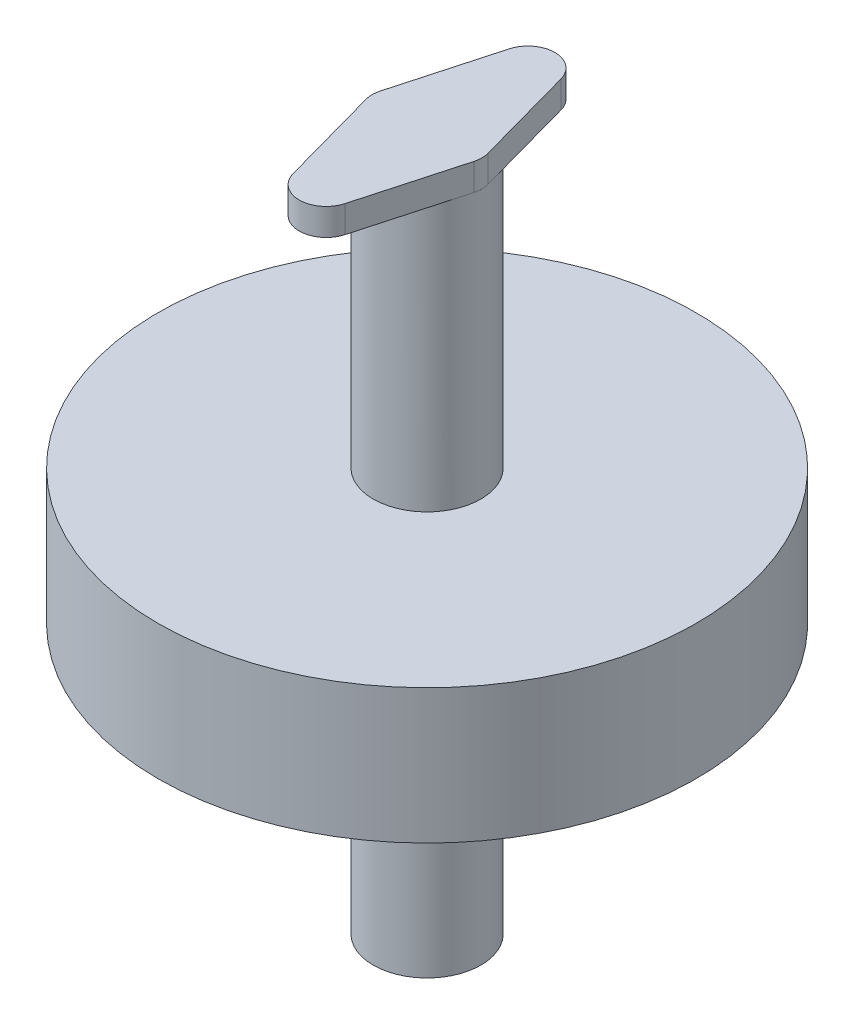
ISO-10303-21;
HEADER;
FILE_DESCRIPTION(('STEP AP214'),'2;1');
FILE_NAME('part.step','',(''),(''),'','','');
FILE_SCHEMA(('AUTOMOTIVE_DESIGN { 1 0 10303 214 1 1 1 1 }'));
ENDSEC;
DATA;
#1=APPLICATION_CONTEXT('core data for automotive mechanical design processes');
#2=APPLICATION_PROTOCOL_DEFINITION('international standard','automotive_design',2000,#1);
#3=PRODUCT_CONTEXT('',#1,'mechanical');
#4=PRODUCT('Part','Part','',(#3));
#5=PRODUCT_RELATED_PRODUCT_CATEGORY('part','',(#4));
#6=PRODUCT_DEFINITION_FORMATION('','',#4);
#7=PRODUCT_DEFINITION_CONTEXT('part definition',#1,'design');
#8=PRODUCT_DEFINITION('design','',#6,#7);
#9=PRODUCT_DEFINITION_SHAPE('','',#8);
#10=(LENGTH_UNIT() NAMED_UNIT(*) SI_UNIT(.MILLI.,.METRE.));
#11=(NAMED_UNIT(*) PLANE_ANGLE_UNIT() SI_UNIT($,.RADIAN.));
#12=(NAMED_UNIT(*) SI_UNIT($,.STERADIAN.) SOLID_ANGLE_UNIT());
#13=UNCERTAINTY_MEASURE_WITH_UNIT(LENGTH_MEASURE(1.E-05),#10,'distance_accuracy_value','');
#14=(GEOMETRIC_REPRESENTATION_CONTEXT(3) GLOBAL_UNCERTAINTY_ASSIGNED_CONTEXT((#13)) GLOBAL_UNIT_ASSIGNED_CONTEXT((#10,
#11,#12)) REPRESENTATION_CONTEXT('',''));
#15=CARTESIAN_POINT('',(0.,0.,0.));
#16=DIRECTION('',(0.,0.,1.));
#17=DIRECTION('',(1.,0.,0.));
#18=AXIS2_PLACEMENT_3D('',#15,#16,#17);
#19=CARTESIAN_POINT('',(0.,5.,0.));
#20=DIRECTION('',(0.,-1.,0.));
#21=DIRECTION('',(0.,0.,-1.));
#22=AXIS2_PLACEMENT_3D('',#19,#20,#21);
#23=CYLINDRICAL_SURFACE('',#22,10.);
#24=CARTESIAN_POINT('',(0.,5.,0.));
#25=DIRECTION('',(0.,1.,0.));
#26=DIRECTION('',(0.,0.,1.));
#27=AXIS2_PLACEMENT_3D('',#24,#25,#26);
#28=CIRCLE('',#27,10.);
#29=CARTESIAN_POINT('',(0.,5.,10.));
#30=VERTEX_POINT('',#29);
#31=EDGE_CURVE('E171',#30,#30,#28,.T.);
#32=ORIENTED_EDGE('',*,*,#31,.F.);
#33=EDGE_LOOP('',(#32));
#34=FACE_BOUND('',#33,.T.);
#35=CARTESIAN_POINT('',(0.,0.,0.));
#36=DIRECTION('',(0.,1.,0.));
#37=DIRECTION('',(0.,0.,1.));
#38=AXIS2_PLACEMENT_3D('',#35,#36,#37);
#39=CIRCLE('',#38,10.);
#40=CARTESIAN_POINT('',(0.,0.,10.));
#41=VERTEX_POINT('',#40);
#42=EDGE_CURVE('E174',#41,#41,#39,.T.);
#43=ORIENTED_EDGE('',*,*,#42,.T.);
#44=EDGE_LOOP('',(#43));
#45=FACE_BOUND('',#44,.T.);
#46=ADVANCED_FACE('F39',(#34,#45),#23,.T.);
#47=CARTESIAN_POINT('',(0.,5.,0.));
#48=DIRECTION('',(0.,1.,0.));
#49=DIRECTION('',(0.,0.,1.));
#50=AXIS2_PLACEMENT_3D('',#47,#48,#49);
#51=PLANE('',#50);
#52=CARTESIAN_POINT('',(0.,5.,0.));
#53=DIRECTION('',(0.,1.,0.));
#54=DIRECTION('',(0.,0.,1.));
#55=AXIS2_PLACEMENT_3D('',#52,#53,#54);
#56=CIRCLE('',#55,2.);
#57=CARTESIAN_POINT('',(0.,5.,2.));
#58=VERTEX_POINT('',#57);
#59=EDGE_CURVE('E167',#58,#58,#56,.T.);
#60=ORIENTED_EDGE('',*,*,#59,.F.);
#61=EDGE_LOOP('',(#60));
#62=FACE_BOUND('',#61,.T.);
#63=ORIENTED_EDGE('',*,*,#31,.T.);
#64=EDGE_LOOP('',(#63));
#65=FACE_BOUND('',#64,.T.);
#66=ADVANCED_FACE('F237',(#62,#65),#51,.T.);
#67=CARTESIAN_POINT('',(0.,0.,0.));
#68=DIRECTION('',(0.,1.,0.));
#69=DIRECTION('',(0.,0.,1.));
#70=AXIS2_PLACEMENT_3D('',#67,#68,#69);
#71=PLANE('',#70);
#72=CARTESIAN_POINT('',(0.,0.,0.));
#73=DIRECTION('',(0.,1.,0.));
#74=DIRECTION('',(0.,0.,1.));
#75=AXIS2_PLACEMENT_3D('',#72,#73,#74);
#76=CIRCLE('',#75,2.);
#77=CARTESIAN_POINT('',(0.,0.,2.));
#78=VERTEX_POINT('',#77);
#79=EDGE_CURVE('E166',#78,#78,#76,.T.);
#80=ORIENTED_EDGE('',*,*,#79,.T.);
#81=EDGE_LOOP('',(#80));
#82=FACE_BOUND('',#81,.T.);
#83=ORIENTED_EDGE('',*,*,#42,.F.);
#84=EDGE_LOOP('',(#83));
#85=FACE_BOUND('',#84,.T.);
#86=ADVANCED_FACE('F243',(#82,#85),#71,.F.);
#87=CARTESIAN_POINT('',(0.,-10.,0.));
#88=DIRECTION('',(0.,1.,0.));
#89=DIRECTION('',(0.,0.,1.));
#90=AXIS2_PLACEMENT_3D('',#87,#88,#89);
#91=PLANE('',#90);
#92=CARTESIAN_POINT('',(0.,-10.,0.));
#93=DIRECTION('',(0.,1.,0.));
#94=DIRECTION('',(0.,0.,1.));
#95=AXIS2_PLACEMENT_3D('',#92,#93,#94);
#96=CIRCLE('',#95,2.);
#97=CARTESIAN_POINT('',(0.,-10.,2.));
#98=VERTEX_POINT('',#97);
#99=EDGE_CURVE('E144',#98,#98,#96,.T.);
#100=ORIENTED_EDGE('',*,*,#99,.F.);
#101=EDGE_LOOP('',(#100));
#102=FACE_BOUND('',#101,.T.);
#103=ADVANCED_FACE('F360',(#102),#91,.F.);
#104=CARTESIAN_POINT('',(0.,-10.,0.));
#105=DIRECTION('',(0.,1.,0.));
#106=DIRECTION('',(0.,0.,1.));
#107=AXIS2_PLACEMENT_3D('',#104,#105,#106);
#108=CYLINDRICAL_SURFACE('',#107,2.);
#109=ORIENTED_EDGE('',*,*,#99,.T.);
#110=EDGE_LOOP('',(#109));
#111=FACE_BOUND('',#110,.T.);
#112=ORIENTED_EDGE('',*,*,#79,.F.);
#113=EDGE_LOOP('',(#112));
#114=FACE_BOUND('',#113,.T.);
#115=ADVANCED_FACE('F351',(#111,#114),#108,.T.);
#116=ORIENTED_EDGE('',*,*,#59,.T.);
#117=EDGE_LOOP('',(#116));
#118=FACE_BOUND('',#117,.T.);
#119=CARTESIAN_POINT('',(0.,15.,0.));
#120=DIRECTION('',(0.,1.,0.));
#121=DIRECTION('',(0.,0.,1.));
#122=AXIS2_PLACEMENT_3D('',#119,#120,#121);
#123=CIRCLE('',#122,2.);
#124=CARTESIAN_POINT('',(1.92757763930679,15.,0.533333333333333));
#125=VERTEX_POINT('',#124);
#126=CARTESIAN_POINT('',(1.92757763930679,15.,-0.533333333333333));
#127=VERTEX_POINT('',#126);
#128=EDGE_CURVE('E134',#125,#127,#123,.T.);
#129=ORIENTED_EDGE('',*,*,#128,.F.);
#130=CARTESIAN_POINT('',(-1.92757763930679,15.,0.533333333333333));
#131=VERTEX_POINT('',#130);
#132=EDGE_CURVE('E137',#131,#125,#123,.T.);
#133=ORIENTED_EDGE('',*,*,#132,.F.);
#134=CARTESIAN_POINT('',(-1.92757763930679,15.,-0.533333333333333));
#135=VERTEX_POINT('',#134);
#136=EDGE_CURVE('E150',#135,#131,#123,.T.);
#137=ORIENTED_EDGE('',*,*,#136,.F.);
#138=EDGE_CURVE('E140',#127,#135,#123,.T.);
#139=ORIENTED_EDGE('',*,*,#138,.F.);
#140=EDGE_LOOP('',(#129,#133,#137,#139));
#141=FACE_BOUND('',#140,.T.);
#142=ADVANCED_FACE('F135',(#118,#141),#108,.T.);
#143=CARTESIAN_POINT('',(0.,15.,0.));
#144=DIRECTION('',(0.,-1.,0.));
#145=DIRECTION('',(0.,0.,-1.));
#146=AXIS2_PLACEMENT_3D('',#143,#144,#145);
#147=PLANE('',#146);
#148=DIRECTION('',(-0.266666666666667,0.,-0.963788819653397));
#149=VECTOR('',#148,1.);
#150=CARTESIAN_POINT('',(0.,15.,-7.5));
#151=LINE('',#150,#149);
#152=CARTESIAN_POINT('',(2.00136051545251,15.,-0.266666666666668));
#153=VERTEX_POINT('',#152);
#154=EDGE_CURVE('E158',#153,#127,#151,.T.);
#155=ORIENTED_EDGE('',*,*,#154,.F.);
#156=CARTESIAN_POINT('',(1.03757169579911,15.,0.));
#157=DIRECTION('',(0.,-1.,0.));
#158=DIRECTION('',(0.,0.,-1.));
#159=AXIS2_PLACEMENT_3D('',#156,#157,#158);
#160=CIRCLE('',#159,1.);
#161=CARTESIAN_POINT('',(2.00136051545251,15.,0.266666666666666));
#162=VERTEX_POINT('',#161);
#163=EDGE_CURVE('E153',#153,#162,#160,.T.);
#164=ORIENTED_EDGE('',*,*,#163,.T.);
#165=DIRECTION('',(0.266666666666667,0.,-0.963788819653397));
#166=VECTOR('',#165,1.);
#167=CARTESIAN_POINT('',(2.07514339159822,15.,0.));
#168=LINE('',#167,#166);
#169=EDGE_CURVE('E121',#125,#162,#168,.T.);
#170=ORIENTED_EDGE('',*,*,#169,.F.);
#171=ORIENTED_EDGE('',*,*,#128,.T.);
#172=EDGE_LOOP('',(#155,#164,#170,#171));
#173=FACE_BOUND('',#172,.T.);
#174=ADVANCED_FACE('F152',(#173),#147,.T.);
#175=DIRECTION('',(-0.266666666666667,0.,0.963788819653397));
#176=VECTOR('',#175,1.);
#177=CARTESIAN_POINT('',(-2.07514339159822,15.,0.));
#178=LINE('',#177,#176);
#179=CARTESIAN_POINT('',(-0.963788819653397,15.,-4.01666666666667));
#180=VERTEX_POINT('',#179);
#181=EDGE_CURVE('E161',#180,#135,#178,.T.);
#182=ORIENTED_EDGE('',*,*,#181,.F.);
#183=CARTESIAN_POINT('',(0.,15.,-3.75));
#184=DIRECTION('',(0.,-1.,0.));
#185=DIRECTION('',(0.,0.,-1.));
#186=AXIS2_PLACEMENT_3D('',#183,#184,#185);
#187=CIRCLE('',#186,1.);
#188=CARTESIAN_POINT('',(0.963788819653397,15.,-4.01666666666667));
#189=VERTEX_POINT('',#188);
#190=EDGE_CURVE('E11',#180,#189,#187,.T.);
#191=ORIENTED_EDGE('',*,*,#190,.T.);
#192=EDGE_CURVE('E128',#127,#189,#151,.T.);
#193=ORIENTED_EDGE('',*,*,#192,.F.);
#194=ORIENTED_EDGE('',*,*,#138,.T.);
#195=EDGE_LOOP('',(#182,#191,#193,#194));
#196=FACE_BOUND('',#195,.T.);
#197=ADVANCED_FACE('F226',(#196),#147,.T.);
#198=DIRECTION('',(0.266666666666667,0.,0.963788819653397));
#199=VECTOR('',#198,1.);
#200=CARTESIAN_POINT('',(0.,15.,7.5));
#201=LINE('',#200,#199);
#202=CARTESIAN_POINT('',(-2.00136051545251,15.,0.266666666666668));
#203=VERTEX_POINT('',#202);
#204=EDGE_CURVE('E154',#203,#131,#201,.T.);
#205=ORIENTED_EDGE('',*,*,#204,.F.);
#206=CARTESIAN_POINT('',(-1.03757169579911,15.,0.));
#207=DIRECTION('',(0.,-1.,0.));
#208=DIRECTION('',(0.,0.,-1.));
#209=AXIS2_PLACEMENT_3D('',#206,#207,#208);
#210=CIRCLE('',#209,1.);
#211=CARTESIAN_POINT('',(-2.00136051545251,15.,-0.266666666666666));
#212=VERTEX_POINT('',#211);
#213=EDGE_CURVE('E60',#203,#212,#210,.T.);
#214=ORIENTED_EDGE('',*,*,#213,.T.);
#215=EDGE_CURVE('E160',#135,#212,#178,.T.);
#216=ORIENTED_EDGE('',*,*,#215,.F.);
#217=ORIENTED_EDGE('',*,*,#136,.T.);
#218=EDGE_LOOP('',(#205,#214,#216,#217));
#219=FACE_BOUND('',#218,.T.);
#220=ADVANCED_FACE('F223',(#219),#147,.T.);
#221=CARTESIAN_POINT('',(0.,16.,7.5));
#222=DIRECTION('',(0.963788819653397,0.,-0.266666666666667));
#223=DIRECTION('',(-0.266666666666667,0.,-0.963788819653397));
#224=AXIS2_PLACEMENT_3D('',#221,#222,#223);
#225=PLANE('',#224);
#226=CARTESIAN_POINT('',(-0.963788819653397,15.,4.01666666666667));
#227=VERTEX_POINT('',#226);
#228=EDGE_CURVE('E149',#131,#227,#201,.T.);
#229=ORIENTED_EDGE('',*,*,#228,.T.);
#230=DIRECTION('',(0.,-1.,0.));
#231=VECTOR('',#230,1.);
#232=CARTESIAN_POINT('',(-0.963788819653397,16.,4.01666666666667));
#233=LINE('',#232,#231);
#234=CARTESIAN_POINT('',(-0.963788819653397,16.,4.01666666666667));
#235=VERTEX_POINT('',#234);
#236=EDGE_CURVE('E200',#227,#235,#233,.F.);
#237=ORIENTED_EDGE('',*,*,#236,.T.);
#238=DIRECTION('',(0.266666666666667,0.,0.963788819653397));
#239=VECTOR('',#238,1.);
#240=CARTESIAN_POINT('',(0.,16.,7.5));
#241=LINE('',#240,#239);
#242=CARTESIAN_POINT('',(-2.00136051545251,16.,0.266666666666668));
#243=VERTEX_POINT('',#242);
#244=EDGE_CURVE('E162',#243,#235,#241,.T.);
#245=ORIENTED_EDGE('',*,*,#244,.F.);
#246=DIRECTION('',(0.,-1.,0.));
#247=VECTOR('',#246,1.);
#248=CARTESIAN_POINT('',(-2.00136051545251,16.,0.266666666666668));
#249=LINE('',#248,#247);
#250=EDGE_CURVE('E197',#243,#203,#249,.T.);
#251=ORIENTED_EDGE('',*,*,#250,.T.);
#252=ORIENTED_EDGE('',*,*,#204,.T.);
#253=EDGE_LOOP('',(#229,#237,#245,#251,#252));
#254=FACE_BOUND('',#253,.T.);
#255=ADVANCED_FACE('F222',(#254),#225,.F.);
#256=CARTESIAN_POINT('',(2.07514339159822,16.,0.));
#257=DIRECTION('',(-0.963788819653397,0.,-0.266666666666667));
#258=DIRECTION('',(-0.266666666666667,0.,0.963788819653397));
#259=AXIS2_PLACEMENT_3D('',#256,#257,#258);
#260=PLANE('',#259);
#261=ORIENTED_EDGE('',*,*,#169,.T.);
#262=DIRECTION('',(0.,-1.,0.));
#263=VECTOR('',#262,1.);
#264=CARTESIAN_POINT('',(2.00136051545251,16.,0.266666666666667));
#265=LINE('',#264,#263);
#266=CARTESIAN_POINT('',(2.00136051545251,16.,0.266666666666666));
#267=VERTEX_POINT('',#266);
#268=EDGE_CURVE('E185',#162,#267,#265,.F.);
#269=ORIENTED_EDGE('',*,*,#268,.T.);
#270=DIRECTION('',(0.266666666666667,0.,-0.963788819653397));
#271=VECTOR('',#270,1.);
#272=CARTESIAN_POINT('',(2.07514339159822,16.,0.));
#273=LINE('',#272,#271);
#274=CARTESIAN_POINT('',(0.963788819653397,16.,4.01666666666667));
#275=VERTEX_POINT('',#274);
#276=EDGE_CURVE('E260',#275,#267,#273,.T.);
#277=ORIENTED_EDGE('',*,*,#276,.F.);
#278=DIRECTION('',(0.,-1.,0.));
#279=VECTOR('',#278,1.);
#280=CARTESIAN_POINT('',(0.963788819653397,16.,4.01666666666667));
#281=LINE('',#280,#279);
#282=CARTESIAN_POINT('',(0.963788819653397,15.,4.01666666666667));
#283=VERTEX_POINT('',#282);
#284=EDGE_CURVE('E125',#275,#283,#281,.T.);
#285=ORIENTED_EDGE('',*,*,#284,.T.);
#286=EDGE_CURVE('E117',#283,#125,#168,.T.);
#287=ORIENTED_EDGE('',*,*,#286,.T.);
#288=EDGE_LOOP('',(#261,#269,#277,#285,#287));
#289=FACE_BOUND('',#288,.T.);
#290=ADVANCED_FACE('F119',(#289),#260,.F.);
#291=CARTESIAN_POINT('',(0.,16.,-7.5));
#292=DIRECTION('',(-0.963788819653397,0.,0.266666666666667));
#293=DIRECTION('',(0.266666666666667,0.,0.963788819653397));
#294=AXIS2_PLACEMENT_3D('',#291,#292,#293);
#295=PLANE('',#294);
#296=DIRECTION('',(-0.266666666666667,0.,-0.963788819653397));
#297=VECTOR('',#296,1.);
#298=CARTESIAN_POINT('',(0.,16.,-7.5));
#299=LINE('',#298,#297);
#300=CARTESIAN_POINT('',(2.00136051545251,16.,-0.266666666666668));
#301=VERTEX_POINT('',#300);
#302=CARTESIAN_POINT('',(0.963788819653397,16.,-4.01666666666667));
#303=VERTEX_POINT('',#302);
#304=EDGE_CURVE('E218',#301,#303,#299,.T.);
#305=ORIENTED_EDGE('',*,*,#304,.F.);
#306=DIRECTION('',(0.,-1.,0.));
#307=VECTOR('',#306,1.);
#308=CARTESIAN_POINT('',(2.00136051545251,16.,-0.266666666666668));
#309=LINE('',#308,#307);
#310=EDGE_CURVE('E180',#301,#153,#309,.T.);
#311=ORIENTED_EDGE('',*,*,#310,.T.);
#312=ORIENTED_EDGE('',*,*,#154,.T.);
#313=ORIENTED_EDGE('',*,*,#192,.T.);
#314=DIRECTION('',(0.,-1.,0.));
#315=VECTOR('',#314,1.);
#316=CARTESIAN_POINT('',(0.963788819653397,16.,-4.01666666666667));
#317=LINE('',#316,#315);
#318=EDGE_CURVE('E170',#189,#303,#317,.F.);
#319=ORIENTED_EDGE('',*,*,#318,.T.);
#320=EDGE_LOOP('',(#305,#311,#312,#313,#319));
#321=FACE_BOUND('',#320,.T.);
#322=ADVANCED_FACE('F230',(#321),#295,.F.);
#323=CARTESIAN_POINT('',(-2.07514339159822,16.,0.));
#324=DIRECTION('',(0.963788819653397,0.,0.266666666666667));
#325=DIRECTION('',(0.266666666666667,0.,-0.963788819653397));
#326=AXIS2_PLACEMENT_3D('',#323,#324,#325);
#327=PLANE('',#326);
#328=ORIENTED_EDGE('',*,*,#215,.T.);
#329=DIRECTION('',(0.,-1.,0.));
#330=VECTOR('',#329,1.);
#331=CARTESIAN_POINT('',(-2.00136051545251,16.,-0.266666666666667));
#332=LINE('',#331,#330);
#333=CARTESIAN_POINT('',(-2.00136051545251,16.,-0.266666666666666));
#334=VERTEX_POINT('',#333);
#335=EDGE_CURVE('E47',#212,#334,#332,.F.);
#336=ORIENTED_EDGE('',*,*,#335,.T.);
#337=DIRECTION('',(-0.266666666666667,0.,0.963788819653397));
#338=VECTOR('',#337,1.);
#339=CARTESIAN_POINT('',(-2.07514339159822,16.,0.));
#340=LINE('',#339,#338);
#341=CARTESIAN_POINT('',(-0.963788819653397,16.,-4.01666666666667));
#342=VERTEX_POINT('',#341);
#343=EDGE_CURVE('E151',#342,#334,#340,.T.);
#344=ORIENTED_EDGE('',*,*,#343,.F.);
#345=DIRECTION('',(0.,-1.,0.));
#346=VECTOR('',#345,1.);
#347=CARTESIAN_POINT('',(-0.963788819653397,16.,-4.01666666666667));
#348=LINE('',#347,#346);
#349=EDGE_CURVE('E203',#342,#180,#348,.T.);
#350=ORIENTED_EDGE('',*,*,#349,.T.);
#351=ORIENTED_EDGE('',*,*,#181,.T.);
#352=EDGE_LOOP('',(#328,#336,#344,#350,#351));
#353=FACE_BOUND('',#352,.T.);
#354=ADVANCED_FACE('F208',(#353),#327,.F.);
#355=CARTESIAN_POINT('',(0.,16.,0.));
#356=DIRECTION('',(0.,-1.,0.));
#357=DIRECTION('',(0.,0.,-1.));
#358=AXIS2_PLACEMENT_3D('',#355,#356,#357);
#359=PLANE('',#358);
#360=ORIENTED_EDGE('',*,*,#276,.T.);
#361=CARTESIAN_POINT('',(1.03757169579911,16.,0.));
#362=DIRECTION('',(0.,-1.,0.));
#363=DIRECTION('',(0.,0.,-1.));
#364=AXIS2_PLACEMENT_3D('',#361,#362,#363);
#365=CIRCLE('',#364,1.);
#366=EDGE_CURVE('E193',#267,#301,#365,.F.);
#367=ORIENTED_EDGE('',*,*,#366,.T.);
#368=ORIENTED_EDGE('',*,*,#304,.T.);
#369=CARTESIAN_POINT('',(0.,16.,-3.75));
#370=DIRECTION('',(0.,-1.,0.));
#371=DIRECTION('',(0.,0.,-1.));
#372=AXIS2_PLACEMENT_3D('',#369,#370,#371);
#373=CIRCLE('',#372,1.);
#374=EDGE_CURVE('E187',#303,#342,#373,.F.);
#375=ORIENTED_EDGE('',*,*,#374,.T.);
#376=ORIENTED_EDGE('',*,*,#343,.T.);
#377=CARTESIAN_POINT('',(-1.03757169579911,16.,0.));
#378=DIRECTION('',(0.,-1.,0.));
#379=DIRECTION('',(0.,0.,-1.));
#380=AXIS2_PLACEMENT_3D('',#377,#378,#379);
#381=CIRCLE('',#380,1.);
#382=EDGE_CURVE('E189',#334,#243,#381,.F.);
#383=ORIENTED_EDGE('',*,*,#382,.T.);
#384=ORIENTED_EDGE('',*,*,#244,.T.);
#385=CARTESIAN_POINT('',(0.,16.,3.75));
#386=DIRECTION('',(0.,-1.,0.));
#387=DIRECTION('',(0.,0.,-1.));
#388=AXIS2_PLACEMENT_3D('',#385,#386,#387);
#389=CIRCLE('',#388,1.);
#390=EDGE_CURVE('E191',#235,#275,#389,.F.);
#391=ORIENTED_EDGE('',*,*,#390,.T.);
#392=EDGE_LOOP('',(#360,#367,#368,#375,#376,#383,#384,#391));
#393=FACE_BOUND('',#392,.T.);
#394=ADVANCED_FACE('F213',(#393),#359,.F.);
#395=ORIENTED_EDGE('',*,*,#286,.F.);
#396=CARTESIAN_POINT('',(0.,15.,3.75));
#397=DIRECTION('',(0.,-1.,0.));
#398=DIRECTION('',(0.,0.,-1.));
#399=AXIS2_PLACEMENT_3D('',#396,#397,#398);
#400=CIRCLE('',#399,1.);
#401=EDGE_CURVE('E195',#283,#227,#400,.T.);
#402=ORIENTED_EDGE('',*,*,#401,.T.);
#403=ORIENTED_EDGE('',*,*,#228,.F.);
#404=ORIENTED_EDGE('',*,*,#132,.T.);
#405=EDGE_LOOP('',(#395,#402,#403,#404));
#406=FACE_BOUND('',#405,.T.);
#407=ADVANCED_FACE('F147',(#406),#147,.T.);
#408=CARTESIAN_POINT('',(1.03757169579911,16.,0.));
#409=DIRECTION('',(0.,-1.,0.));
#410=DIRECTION('',(0.,0.,-1.));
#411=AXIS2_PLACEMENT_3D('',#408,#409,#410);
#412=CYLINDRICAL_SURFACE('',#411,1.);
#413=ORIENTED_EDGE('',*,*,#366,.F.);
#414=ORIENTED_EDGE('',*,*,#268,.F.);
#415=ORIENTED_EDGE('',*,*,#163,.F.);
#416=ORIENTED_EDGE('',*,*,#310,.F.);
#417=EDGE_LOOP('',(#413,#414,#415,#416));
#418=FACE_BOUND('',#417,.T.);
#419=ADVANCED_FACE('F250',(#418),#412,.T.);
#420=CARTESIAN_POINT('',(0.,16.,3.75));
#421=DIRECTION('',(0.,-1.,0.));
#422=DIRECTION('',(0.,0.,-1.));
#423=AXIS2_PLACEMENT_3D('',#420,#421,#422);
#424=CYLINDRICAL_SURFACE('',#423,1.);
#425=ORIENTED_EDGE('',*,*,#390,.F.);
#426=ORIENTED_EDGE('',*,*,#236,.F.);
#427=ORIENTED_EDGE('',*,*,#401,.F.);
#428=ORIENTED_EDGE('',*,*,#284,.F.);
#429=EDGE_LOOP('',(#425,#426,#427,#428));
#430=FACE_BOUND('',#429,.T.);
#431=ADVANCED_FACE('F235',(#430),#424,.T.);
#432=CARTESIAN_POINT('',(-1.03757169579911,16.,0.));
#433=DIRECTION('',(0.,-1.,0.));
#434=DIRECTION('',(0.,0.,-1.));
#435=AXIS2_PLACEMENT_3D('',#432,#433,#434);
#436=CYLINDRICAL_SURFACE('',#435,1.);
#437=ORIENTED_EDGE('',*,*,#382,.F.);
#438=ORIENTED_EDGE('',*,*,#335,.F.);
#439=ORIENTED_EDGE('',*,*,#213,.F.);
#440=ORIENTED_EDGE('',*,*,#250,.F.);
#441=EDGE_LOOP('',(#437,#438,#439,#440));
#442=FACE_BOUND('',#441,.T.);
#443=ADVANCED_FACE('F220',(#442),#436,.T.);
#444=CARTESIAN_POINT('',(0.,16.,-3.75));
#445=DIRECTION('',(0.,-1.,0.));
#446=DIRECTION('',(0.,0.,-1.));
#447=AXIS2_PLACEMENT_3D('',#444,#445,#446);
#448=CYLINDRICAL_SURFACE('',#447,1.);
#449=ORIENTED_EDGE('',*,*,#374,.F.);
#450=ORIENTED_EDGE('',*,*,#318,.F.);
#451=ORIENTED_EDGE('',*,*,#190,.F.);
#452=ORIENTED_EDGE('',*,*,#349,.F.);
#453=EDGE_LOOP('',(#449,#450,#451,#452));
#454=FACE_BOUND('',#453,.T.);
#455=ADVANCED_FACE('F41',(#454),#448,.T.);
#456=CLOSED_SHELL('',(#46,#66,#86,#103,#115,#142,#174,#197,#220,#255,#290,#322,#354,#394,#407,
#419,#431,#443,#455));
#457=MANIFOLD_SOLID_BREP('B2',#456);
#458=ADVANCED_BREP_SHAPE_REPRESENTATION('',(#18,#457),#14);
#459=SHAPE_DEFINITION_REPRESENTATION(#9,#458);
ENDSEC;
END-ISO-10303-21;
